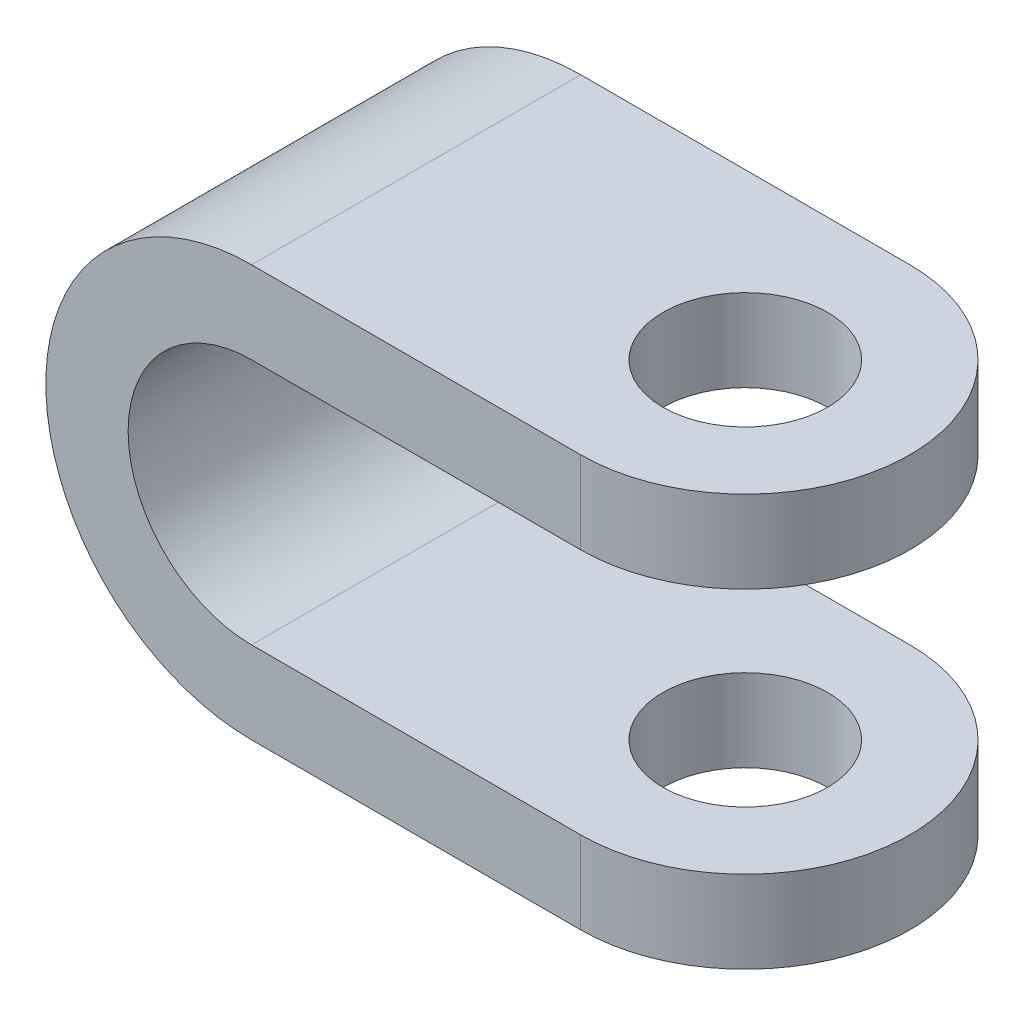
ISO-10303-21;
HEADER;
FILE_DESCRIPTION(('STEP AP214'),'2;1');
FILE_NAME('part.step','',(''),(''),'','','');
FILE_SCHEMA(('AUTOMOTIVE_DESIGN { 1 0 10303 214 1 1 1 1 }'));
ENDSEC;
DATA;
#1=APPLICATION_CONTEXT('core data for automotive mechanical design processes');
#2=APPLICATION_PROTOCOL_DEFINITION('international standard','automotive_design',2000,#1);
#3=PRODUCT_CONTEXT('',#1,'mechanical');
#4=PRODUCT('Part','Part','',(#3));
#5=PRODUCT_RELATED_PRODUCT_CATEGORY('part','',(#4));
#6=PRODUCT_DEFINITION_FORMATION('','',#4);
#7=PRODUCT_DEFINITION_CONTEXT('part definition',#1,'design');
#8=PRODUCT_DEFINITION('design','',#6,#7);
#9=PRODUCT_DEFINITION_SHAPE('','',#8);
#10=(LENGTH_UNIT() NAMED_UNIT(*) SI_UNIT(.MILLI.,.METRE.));
#11=(NAMED_UNIT(*) PLANE_ANGLE_UNIT() SI_UNIT($,.RADIAN.));
#12=(NAMED_UNIT(*) SI_UNIT($,.STERADIAN.) SOLID_ANGLE_UNIT());
#13=UNCERTAINTY_MEASURE_WITH_UNIT(LENGTH_MEASURE(1.E-05),#10,'distance_accuracy_value','');
#14=(GEOMETRIC_REPRESENTATION_CONTEXT(3) GLOBAL_UNCERTAINTY_ASSIGNED_CONTEXT((#13)) GLOBAL_UNIT_ASSIGNED_CONTEXT((#10,
#11,#12)) REPRESENTATION_CONTEXT('',''));
#15=CARTESIAN_POINT('',(0.,0.,0.));
#16=DIRECTION('',(0.,0.,1.));
#17=DIRECTION('',(1.,0.,0.));
#18=AXIS2_PLACEMENT_3D('',#15,#16,#17);
#19=CARTESIAN_POINT('',(-20.,-90.,45.));
#20=DIRECTION('',(0.,1.,0.));
#21=DIRECTION('',(0.,0.,1.));
#22=AXIS2_PLACEMENT_3D('',#19,#20,#21);
#23=CYLINDRICAL_SURFACE('',#22,10.);
#24=CARTESIAN_POINT('',(-20.,-25.,45.));
#25=DIRECTION('',(0.,-1.,0.));
#26=DIRECTION('',(1.,0.,0.));
#27=AXIS2_PLACEMENT_3D('',#24,#25,#26);
#28=CIRCLE('',#27,10.);
#29=CARTESIAN_POINT('',(-20.,-25.,55.));
#30=VERTEX_POINT('',#29);
#31=EDGE_CURVE('E201',#30,#30,#28,.F.);
#32=CARTESIAN_POINT('',(-20.,-15.,45.));
#33=DIRECTION('',(0.,-1.,0.));
#34=DIRECTION('',(1.,0.,0.));
#35=AXIS2_PLACEMENT_3D('',#32,#33,#34);
#36=CIRCLE('',#35,10.);
#37=CARTESIAN_POINT('',(-20.,-15.,55.));
#38=VERTEX_POINT('',#37);
#39=EDGE_CURVE('E123',#38,#38,#36,.F.);
#40=CARTESIAN_POINT('',(-20.,-25.,55.));
#41=CARTESIAN_POINT('',(-20.,-24.8958333333333,55.));
#42=CARTESIAN_POINT('',(-20.,-24.7916666666667,55.));
#43=CARTESIAN_POINT('',(-20.,-24.5833333333333,55.));
#44=CARTESIAN_POINT('',(-20.,-24.4791666666667,55.));
#45=CARTESIAN_POINT('',(-20.,-24.2708333333333,55.));
#46=CARTESIAN_POINT('',(-20.,-24.1666666666667,55.));
#47=CARTESIAN_POINT('',(-20.,-23.9583333333333,55.));
#48=CARTESIAN_POINT('',(-20.,-23.8541666666667,55.));
#49=CARTESIAN_POINT('',(-20.,-23.6458333333333,55.));
#50=CARTESIAN_POINT('',(-20.,-23.5416666666667,55.));
#51=CARTESIAN_POINT('',(-20.,-23.3333333333333,55.));
#52=CARTESIAN_POINT('',(-20.,-23.2291666666667,55.));
#53=CARTESIAN_POINT('',(-20.,-23.0208333333333,55.));
#54=CARTESIAN_POINT('',(-20.,-22.9166666666667,55.));
#55=CARTESIAN_POINT('',(-20.,-22.7083333333333,55.));
#56=CARTESIAN_POINT('',(-20.,-22.6041666666667,55.));
#57=CARTESIAN_POINT('',(-20.,-22.3958333333333,55.));
#58=CARTESIAN_POINT('',(-20.,-22.2916666666667,55.));
#59=CARTESIAN_POINT('',(-20.,-22.0833333333333,55.));
#60=CARTESIAN_POINT('',(-20.,-21.9791666666667,55.));
#61=CARTESIAN_POINT('',(-20.,-21.7708333333333,55.));
#62=CARTESIAN_POINT('',(-20.,-21.6666666666667,55.));
#63=CARTESIAN_POINT('',(-20.,-21.4583333333333,55.));
#64=CARTESIAN_POINT('',(-20.,-21.3541666666667,55.));
#65=CARTESIAN_POINT('',(-20.,-21.1458333333333,55.));
#66=CARTESIAN_POINT('',(-20.,-21.0416666666667,55.));
#67=CARTESIAN_POINT('',(-20.,-20.8333333333333,55.));
#68=CARTESIAN_POINT('',(-20.,-20.7291666666667,55.));
#69=CARTESIAN_POINT('',(-20.,-20.5208333333333,55.));
#70=CARTESIAN_POINT('',(-20.,-20.4166666666667,55.));
#71=CARTESIAN_POINT('',(-20.,-20.2083333333333,55.));
#72=CARTESIAN_POINT('',(-20.,-20.1041666666667,55.));
#73=CARTESIAN_POINT('',(-20.,-19.8958333333333,55.));
#74=CARTESIAN_POINT('',(-20.,-19.7916666666667,55.));
#75=CARTESIAN_POINT('',(-20.,-19.5833333333333,55.));
#76=CARTESIAN_POINT('',(-20.,-19.4791666666667,55.));
#77=CARTESIAN_POINT('',(-20.,-19.2708333333333,55.));
#78=CARTESIAN_POINT('',(-20.,-19.1666666666667,55.));
#79=CARTESIAN_POINT('',(-20.,-18.9583333333333,55.));
#80=CARTESIAN_POINT('',(-20.,-18.8541666666667,55.));
#81=CARTESIAN_POINT('',(-20.,-18.6458333333333,55.));
#82=CARTESIAN_POINT('',(-20.,-18.5416666666667,55.));
#83=CARTESIAN_POINT('',(-20.,-18.3333333333333,55.));
#84=CARTESIAN_POINT('',(-20.,-18.2291666666667,55.));
#85=CARTESIAN_POINT('',(-20.,-18.0208333333333,55.));
#86=CARTESIAN_POINT('',(-20.,-17.9166666666667,55.));
#87=CARTESIAN_POINT('',(-20.,-17.7083333333333,55.));
#88=CARTESIAN_POINT('',(-20.,-17.6041666666667,55.));
#89=CARTESIAN_POINT('',(-20.,-17.3958333333333,55.));
#90=CARTESIAN_POINT('',(-20.,-17.2916666666667,55.));
#91=CARTESIAN_POINT('',(-20.,-17.0833333333333,55.));
#92=CARTESIAN_POINT('',(-20.,-16.9791666666667,55.));
#93=CARTESIAN_POINT('',(-20.,-16.7708333333333,55.));
#94=CARTESIAN_POINT('',(-20.,-16.6666666666667,55.));
#95=CARTESIAN_POINT('',(-20.,-16.4583333333333,55.));
#96=CARTESIAN_POINT('',(-20.,-16.3541666666667,55.));
#97=CARTESIAN_POINT('',(-20.,-16.1458333333333,55.));
#98=CARTESIAN_POINT('',(-20.,-16.0416666666667,55.));
#99=CARTESIAN_POINT('',(-20.,-15.8333333333333,55.));
#100=CARTESIAN_POINT('',(-20.,-15.7291666666667,55.));
#101=CARTESIAN_POINT('',(-20.,-15.5208333333333,55.));
#102=CARTESIAN_POINT('',(-20.,-15.4166666666667,55.));
#103=CARTESIAN_POINT('',(-20.,-15.2083333333333,55.));
#104=CARTESIAN_POINT('',(-20.,-15.1041666666667,55.));
#105=CARTESIAN_POINT('',(-20.,-15.,55.));
#106=B_SPLINE_CURVE_WITH_KNOTS('',3,(#40,#41,#42,#43,#44,#45,#46,#47,#48,#49,#50,#51,#52,#53,
#54,#55,#56,#57,#58,#59,#60,#61,#62,#63,#64,#65,#66,#67,#68,#69,#70,#71,#72,#73,#74,#75,#76,#77,
#78,#79,#80,#81,#82,#83,#84,#85,#86,#87,#88,#89,#90,#91,#92,#93,#94,#95,#96,#97,#98,#99,#100,
#101,#102,#103,#104,#105),.UNSPECIFIED.,.F.,.F.,(4,2,2,2,2,2,2,2,2,2,2,2,2,2,2,2,2,2,2,2,2,2,2,
2,2,2,2,2,2,2,2,2,4),(0.,0.312499999999993,0.625000000000001,0.937500000000008,1.25,
1.56249999999999,1.875,2.18750000000001,2.5,2.8125,3.125,3.43750000000001,3.75,4.0625,4.375,
4.68750000000001,5.,5.3125,5.62500000000001,5.93750000000001,6.25000000000001,6.5625,
6.87500000000001,7.18750000000001,7.50000000000001,7.8125,8.12500000000001,8.43750000000001,
8.75000000000001,9.0625,9.37500000000001,9.68750000000002,10.),.UNSPECIFIED.);
#107=EDGE_CURVE('BSEAM43',#30,#38,#106,.T.);
#108=ORIENTED_EDGE('',*,*,#31,.F.);
#109=ORIENTED_EDGE('',*,*,#39,.T.);
#110=ORIENTED_EDGE('',*,*,#107,.T.);
#111=ORIENTED_EDGE('',*,*,#107,.F.);
#112=EDGE_LOOP('',(#108,#110,#109,#111));
#113=FACE_BOUND('',#112,.T.);
#114=ADVANCED_FACE('F43',(#113),#23,.F.);
#115=CARTESIAN_POINT('',(0.,-15.,90.));
#116=DIRECTION('',(0.,-1.,0.));
#117=DIRECTION('',(1.,0.,0.));
#118=AXIS2_PLACEMENT_3D('',#115,#116,#117);
#119=PLANE('',#118);
#120=CARTESIAN_POINT('',(-20.,-15.,45.));
#121=DIRECTION('',(0.,-1.,0.));
#122=DIRECTION('',(1.,0.,0.));
#123=AXIS2_PLACEMENT_3D('',#120,#121,#122);
#124=CIRCLE('',#123,20.);
#125=CARTESIAN_POINT('',(-20.,-15.0000000000001,65.));
#126=VERTEX_POINT('',#125);
#127=CARTESIAN_POINT('',(-20.,-15.,25.));
#128=VERTEX_POINT('',#127);
#129=EDGE_CURVE('E122',#126,#128,#124,.F.);
#130=ORIENTED_EDGE('',*,*,#129,.T.);
#131=DIRECTION('',(-1.,0.,0.));
#132=VECTOR('',#131,1.);
#133=CARTESIAN_POINT('',(-20.,-15.,25.));
#134=LINE('',#133,#132);
#135=CARTESIAN_POINT('',(-60.,-15.,25.));
#136=VERTEX_POINT('',#135);
#137=EDGE_CURVE('E134',#128,#136,#134,.T.);
#138=ORIENTED_EDGE('',*,*,#137,.T.);
#139=DIRECTION('',(0.,0.,-1.));
#140=VECTOR('',#139,1.);
#141=CARTESIAN_POINT('',(-60.,-15.,90.));
#142=LINE('',#141,#140);
#143=CARTESIAN_POINT('',(-60.,-15.,65.));
#144=VERTEX_POINT('',#143);
#145=EDGE_CURVE('E126',#144,#136,#142,.T.);
#146=ORIENTED_EDGE('',*,*,#145,.F.);
#147=DIRECTION('',(1.,0.,0.));
#148=VECTOR('',#147,1.);
#149=CARTESIAN_POINT('',(-85.,-15.,65.));
#150=LINE('',#149,#148);
#151=EDGE_CURVE('E108',#144,#126,#150,.T.);
#152=ORIENTED_EDGE('',*,*,#151,.T.);
#153=EDGE_LOOP('',(#130,#138,#146,#152));
#154=FACE_BOUND('',#153,.T.);
#155=ORIENTED_EDGE('',*,*,#39,.F.);
#156=EDGE_LOOP('',(#155));
#157=FACE_BOUND('',#156,.T.);
#158=ADVANCED_FACE('F132',(#154,#157),#119,.F.);
#159=CARTESIAN_POINT('',(-60.,-40.,90.));
#160=DIRECTION('',(0.,0.,-1.));
#161=DIRECTION('',(-1.,0.,0.));
#162=AXIS2_PLACEMENT_3D('',#159,#160,#161);
#163=CYLINDRICAL_SURFACE('',#162,25.);
#164=ORIENTED_EDGE('',*,*,#145,.T.);
#165=CARTESIAN_POINT('',(-60.,-40.,25.));
#166=DIRECTION('',(0.,0.,-1.));
#167=DIRECTION('',(-1.,0.,0.));
#168=AXIS2_PLACEMENT_3D('',#165,#166,#167);
#169=CIRCLE('',#168,25.);
#170=CARTESIAN_POINT('',(-60.,-65.,25.));
#171=VERTEX_POINT('',#170);
#172=EDGE_CURVE('E59',#136,#171,#169,.F.);
#173=ORIENTED_EDGE('',*,*,#172,.T.);
#174=DIRECTION('',(0.,0.,-1.));
#175=VECTOR('',#174,1.);
#176=CARTESIAN_POINT('',(-60.,-65.,90.));
#177=LINE('',#176,#175);
#178=CARTESIAN_POINT('',(-60.,-65.,65.));
#179=VERTEX_POINT('',#178);
#180=EDGE_CURVE('E128',#179,#171,#177,.T.);
#181=ORIENTED_EDGE('',*,*,#180,.F.);
#182=CARTESIAN_POINT('',(-60.,-40.,65.));
#183=DIRECTION('',(0.,0.,1.));
#184=DIRECTION('',(1.,0.,0.));
#185=AXIS2_PLACEMENT_3D('',#182,#183,#184);
#186=CIRCLE('',#185,25.);
#187=EDGE_CURVE('E113',#179,#144,#186,.F.);
#188=ORIENTED_EDGE('',*,*,#187,.T.);
#189=EDGE_LOOP('',(#164,#173,#181,#188));
#190=FACE_BOUND('',#189,.T.);
#191=ADVANCED_FACE('F125',(#190),#163,.T.);
#192=CARTESIAN_POINT('',(-60.,-65.,90.));
#193=DIRECTION('',(0.,1.,0.));
#194=DIRECTION('',(-1.,0.,0.));
#195=AXIS2_PLACEMENT_3D('',#192,#193,#194);
#196=PLANE('',#195);
#197=ORIENTED_EDGE('',*,*,#180,.T.);
#198=DIRECTION('',(1.,0.,0.));
#199=VECTOR('',#198,1.);
#200=CARTESIAN_POINT('',(-20.,-65.,25.));
#201=LINE('',#200,#199);
#202=CARTESIAN_POINT('',(-20.,-65.,25.));
#203=VERTEX_POINT('',#202);
#204=EDGE_CURVE('E130',#171,#203,#201,.T.);
#205=ORIENTED_EDGE('',*,*,#204,.T.);
#206=CARTESIAN_POINT('',(-20.,-65.,45.));
#207=DIRECTION('',(0.,1.,0.));
#208=DIRECTION('',(-1.,0.,0.));
#209=AXIS2_PLACEMENT_3D('',#206,#207,#208);
#210=CIRCLE('',#209,20.);
#211=CARTESIAN_POINT('',(-20.,-65.,65.));
#212=VERTEX_POINT('',#211);
#213=EDGE_CURVE('E178',#203,#212,#210,.F.);
#214=ORIENTED_EDGE('',*,*,#213,.T.);
#215=DIRECTION('',(-1.,0.,0.));
#216=VECTOR('',#215,1.);
#217=CARTESIAN_POINT('',(-85.,-65.,65.));
#218=LINE('',#217,#216);
#219=EDGE_CURVE('E175',#212,#179,#218,.T.);
#220=ORIENTED_EDGE('',*,*,#219,.T.);
#221=EDGE_LOOP('',(#197,#205,#214,#220));
#222=FACE_BOUND('',#221,.T.);
#223=CARTESIAN_POINT('',(-20.,-65.,45.));
#224=DIRECTION('',(0.,1.,0.));
#225=DIRECTION('',(-1.,0.,0.));
#226=AXIS2_PLACEMENT_3D('',#223,#224,#225);
#227=CIRCLE('',#226,10.);
#228=CARTESIAN_POINT('',(-20.,-65.,55.));
#229=VERTEX_POINT('',#228);
#230=EDGE_CURVE('E174',#229,#229,#227,.F.);
#231=ORIENTED_EDGE('',*,*,#230,.F.);
#232=EDGE_LOOP('',(#231));
#233=FACE_BOUND('',#232,.T.);
#234=ADVANCED_FACE('F213',(#222,#233),#196,.F.);
#235=CARTESIAN_POINT('',(-60.,-55.,90.));
#236=DIRECTION('',(0.,1.,0.));
#237=DIRECTION('',(-1.,0.,0.));
#238=AXIS2_PLACEMENT_3D('',#235,#236,#237);
#239=PLANE('',#238);
#240=DIRECTION('',(1.,0.,0.));
#241=VECTOR('',#240,1.);
#242=CARTESIAN_POINT('',(-20.,-55.,25.));
#243=LINE('',#242,#241);
#244=CARTESIAN_POINT('',(-60.,-55.,25.0000000000001));
#245=VERTEX_POINT('',#244);
#246=CARTESIAN_POINT('',(-20.,-55.,25.));
#247=VERTEX_POINT('',#246);
#248=EDGE_CURVE('E170',#245,#247,#243,.T.);
#249=ORIENTED_EDGE('',*,*,#248,.F.);
#250=DIRECTION('',(0.,0.,-1.));
#251=VECTOR('',#250,1.);
#252=CARTESIAN_POINT('',(-60.,-55.,90.));
#253=LINE('',#252,#251);
#254=CARTESIAN_POINT('',(-60.,-55.,65.));
#255=VERTEX_POINT('',#254);
#256=EDGE_CURVE('E141',#255,#245,#253,.T.);
#257=ORIENTED_EDGE('',*,*,#256,.F.);
#258=DIRECTION('',(-1.,0.,0.));
#259=VECTOR('',#258,1.);
#260=CARTESIAN_POINT('',(-85.,-55.,65.));
#261=LINE('',#260,#259);
#262=CARTESIAN_POINT('',(-20.,-55.,65.));
#263=VERTEX_POINT('',#262);
#264=EDGE_CURVE('E163',#263,#255,#261,.T.);
#265=ORIENTED_EDGE('',*,*,#264,.F.);
#266=CARTESIAN_POINT('',(-20.,-55.,45.));
#267=DIRECTION('',(0.,1.,0.));
#268=DIRECTION('',(-1.,0.,0.));
#269=AXIS2_PLACEMENT_3D('',#266,#267,#268);
#270=CIRCLE('',#269,20.);
#271=EDGE_CURVE('E167',#247,#263,#270,.F.);
#272=ORIENTED_EDGE('',*,*,#271,.F.);
#273=EDGE_LOOP('',(#249,#257,#265,#272));
#274=FACE_BOUND('',#273,.T.);
#275=CARTESIAN_POINT('',(-20.,-55.,45.));
#276=DIRECTION('',(0.,1.,0.));
#277=DIRECTION('',(-1.,0.,0.));
#278=AXIS2_PLACEMENT_3D('',#275,#276,#277);
#279=CIRCLE('',#278,10.);
#280=CARTESIAN_POINT('',(-20.,-55.,55.));
#281=VERTEX_POINT('',#280);
#282=EDGE_CURVE('E52',#281,#281,#279,.F.);
#283=ORIENTED_EDGE('',*,*,#282,.T.);
#284=EDGE_LOOP('',(#283));
#285=FACE_BOUND('',#284,.T.);
#286=ADVANCED_FACE('F215',(#274,#285),#239,.T.);
#287=CARTESIAN_POINT('',(0.,-25.,90.));
#288=DIRECTION('',(0.,-1.,0.));
#289=DIRECTION('',(1.,0.,0.));
#290=AXIS2_PLACEMENT_3D('',#287,#288,#289);
#291=PLANE('',#290);
#292=DIRECTION('',(-1.,0.,0.));
#293=VECTOR('',#292,1.);
#294=CARTESIAN_POINT('',(-20.,-25.,25.));
#295=LINE('',#294,#293);
#296=CARTESIAN_POINT('',(-20.,-25.,25.));
#297=VERTEX_POINT('',#296);
#298=CARTESIAN_POINT('',(-60.,-25.,25.));
#299=VERTEX_POINT('',#298);
#300=EDGE_CURVE('E159',#297,#299,#295,.T.);
#301=ORIENTED_EDGE('',*,*,#300,.F.);
#302=CARTESIAN_POINT('',(-20.,-25.,45.));
#303=DIRECTION('',(0.,-1.,0.));
#304=DIRECTION('',(1.,0.,0.));
#305=AXIS2_PLACEMENT_3D('',#302,#303,#304);
#306=CIRCLE('',#305,20.);
#307=CARTESIAN_POINT('',(-20.,-25.,65.));
#308=VERTEX_POINT('',#307);
#309=EDGE_CURVE('E155',#308,#297,#306,.F.);
#310=ORIENTED_EDGE('',*,*,#309,.F.);
#311=DIRECTION('',(1.,0.,0.));
#312=VECTOR('',#311,1.);
#313=CARTESIAN_POINT('',(-85.,-25.,65.));
#314=LINE('',#313,#312);
#315=CARTESIAN_POINT('',(-60.,-25.,65.));
#316=VERTEX_POINT('',#315);
#317=EDGE_CURVE('E152',#316,#308,#314,.T.);
#318=ORIENTED_EDGE('',*,*,#317,.F.);
#319=DIRECTION('',(0.,0.,-1.));
#320=VECTOR('',#319,1.);
#321=CARTESIAN_POINT('',(-60.,-25.,90.));
#322=LINE('',#321,#320);
#323=EDGE_CURVE('E136',#316,#299,#322,.T.);
#324=ORIENTED_EDGE('',*,*,#323,.T.);
#325=EDGE_LOOP('',(#301,#310,#318,#324));
#326=FACE_BOUND('',#325,.T.);
#327=ORIENTED_EDGE('',*,*,#31,.T.);
#328=EDGE_LOOP('',(#327));
#329=FACE_BOUND('',#328,.T.);
#330=ADVANCED_FACE('F222',(#326,#329),#291,.T.);
#331=CARTESIAN_POINT('',(-60.,-40.,90.));
#332=DIRECTION('',(0.,0.,-1.));
#333=DIRECTION('',(-1.,0.,0.));
#334=AXIS2_PLACEMENT_3D('',#331,#332,#333);
#335=CYLINDRICAL_SURFACE('',#334,15.);
#336=CARTESIAN_POINT('',(-60.,-40.,25.));
#337=DIRECTION('',(0.,0.,-1.));
#338=DIRECTION('',(-1.,0.,0.));
#339=AXIS2_PLACEMENT_3D('',#336,#337,#338);
#340=CIRCLE('',#339,15.);
#341=EDGE_CURVE('E186',#299,#245,#340,.F.);
#342=ORIENTED_EDGE('',*,*,#341,.F.);
#343=ORIENTED_EDGE('',*,*,#323,.F.);
#344=CARTESIAN_POINT('',(-60.,-40.,65.));
#345=DIRECTION('',(0.,0.,1.));
#346=DIRECTION('',(1.,0.,0.));
#347=AXIS2_PLACEMENT_3D('',#344,#345,#346);
#348=CIRCLE('',#347,15.);
#349=EDGE_CURVE('E11',#255,#316,#348,.F.);
#350=ORIENTED_EDGE('',*,*,#349,.F.);
#351=ORIENTED_EDGE('',*,*,#256,.T.);
#352=EDGE_LOOP('',(#342,#343,#350,#351));
#353=FACE_BOUND('',#352,.T.);
#354=ADVANCED_FACE('F237',(#353),#335,.F.);
#355=CARTESIAN_POINT('',(-20.,-55.,55.));
#356=CARTESIAN_POINT('',(-20.,-55.1041666666667,55.));
#357=CARTESIAN_POINT('',(-20.,-55.2083333333333,55.));
#358=CARTESIAN_POINT('',(-20.,-55.4166666666667,55.));
#359=CARTESIAN_POINT('',(-20.,-55.5208333333333,55.));
#360=CARTESIAN_POINT('',(-20.,-55.7291666666667,55.));
#361=CARTESIAN_POINT('',(-20.,-55.8333333333333,55.));
#362=CARTESIAN_POINT('',(-20.,-56.0416666666667,55.));
#363=CARTESIAN_POINT('',(-20.,-56.1458333333333,55.));
#364=CARTESIAN_POINT('',(-20.,-56.3541666666667,55.));
#365=CARTESIAN_POINT('',(-20.,-56.4583333333333,55.));
#366=CARTESIAN_POINT('',(-20.,-56.6666666666667,55.));
#367=CARTESIAN_POINT('',(-20.,-56.7708333333333,55.));
#368=CARTESIAN_POINT('',(-20.,-56.9791666666667,55.));
#369=CARTESIAN_POINT('',(-20.,-57.0833333333333,55.));
#370=CARTESIAN_POINT('',(-20.,-57.2916666666667,55.));
#371=CARTESIAN_POINT('',(-20.,-57.3958333333333,55.));
#372=CARTESIAN_POINT('',(-20.,-57.6041666666667,55.));
#373=CARTESIAN_POINT('',(-20.,-57.7083333333333,55.));
#374=CARTESIAN_POINT('',(-20.,-57.9166666666667,55.));
#375=CARTESIAN_POINT('',(-20.,-58.0208333333333,55.));
#376=CARTESIAN_POINT('',(-20.,-58.2291666666667,55.));
#377=CARTESIAN_POINT('',(-20.,-58.3333333333333,55.));
#378=CARTESIAN_POINT('',(-20.,-58.5416666666667,55.));
#379=CARTESIAN_POINT('',(-20.,-58.6458333333333,55.));
#380=CARTESIAN_POINT('',(-20.,-58.8541666666667,55.));
#381=CARTESIAN_POINT('',(-20.,-58.9583333333333,55.));
#382=CARTESIAN_POINT('',(-20.,-59.1666666666667,55.));
#383=CARTESIAN_POINT('',(-20.,-59.2708333333333,55.));
#384=CARTESIAN_POINT('',(-20.,-59.4791666666667,55.));
#385=CARTESIAN_POINT('',(-20.,-59.5833333333333,55.));
#386=CARTESIAN_POINT('',(-20.,-59.7916666666667,55.));
#387=CARTESIAN_POINT('',(-20.,-59.8958333333333,55.));
#388=CARTESIAN_POINT('',(-20.,-60.1041666666667,55.));
#389=CARTESIAN_POINT('',(-20.,-60.2083333333333,55.));
#390=CARTESIAN_POINT('',(-20.,-60.4166666666667,55.));
#391=CARTESIAN_POINT('',(-20.,-60.5208333333333,55.));
#392=CARTESIAN_POINT('',(-20.,-60.7291666666667,55.));
#393=CARTESIAN_POINT('',(-20.,-60.8333333333333,55.));
#394=CARTESIAN_POINT('',(-20.,-61.0416666666667,55.));
#395=CARTESIAN_POINT('',(-20.,-61.1458333333333,55.));
#396=CARTESIAN_POINT('',(-20.,-61.3541666666667,55.));
#397=CARTESIAN_POINT('',(-20.,-61.4583333333333,55.));
#398=CARTESIAN_POINT('',(-20.,-61.6666666666667,55.));
#399=CARTESIAN_POINT('',(-20.,-61.7708333333333,55.));
#400=CARTESIAN_POINT('',(-20.,-61.9791666666667,55.));
#401=CARTESIAN_POINT('',(-20.,-62.0833333333333,55.));
#402=CARTESIAN_POINT('',(-20.,-62.2916666666667,55.));
#403=CARTESIAN_POINT('',(-20.,-62.3958333333333,55.));
#404=CARTESIAN_POINT('',(-20.,-62.6041666666667,55.));
#405=CARTESIAN_POINT('',(-20.,-62.7083333333333,55.));
#406=CARTESIAN_POINT('',(-20.,-62.9166666666667,55.));
#407=CARTESIAN_POINT('',(-20.,-63.0208333333333,55.));
#408=CARTESIAN_POINT('',(-20.,-63.2291666666667,55.));
#409=CARTESIAN_POINT('',(-20.,-63.3333333333333,55.));
#410=CARTESIAN_POINT('',(-20.,-63.5416666666667,55.));
#411=CARTESIAN_POINT('',(-20.,-63.6458333333333,55.));
#412=CARTESIAN_POINT('',(-20.,-63.8541666666667,55.));
#413=CARTESIAN_POINT('',(-20.,-63.9583333333333,55.));
#414=CARTESIAN_POINT('',(-20.,-64.1666666666667,55.));
#415=CARTESIAN_POINT('',(-20.,-64.2708333333333,55.));
#416=CARTESIAN_POINT('',(-20.,-64.4791666666667,55.));
#417=CARTESIAN_POINT('',(-20.,-64.5833333333333,55.));
#418=CARTESIAN_POINT('',(-20.,-64.7916666666667,55.));
#419=CARTESIAN_POINT('',(-20.,-64.8958333333333,55.));
#420=CARTESIAN_POINT('',(-20.,-65.,55.));
#421=B_SPLINE_CURVE_WITH_KNOTS('',3,(#355,#356,#357,#358,#359,#360,#361,#362,#363,#364,#365,
#366,#367,#368,#369,#370,#371,#372,#373,#374,#375,#376,#377,#378,#379,#380,#381,#382,#383,#384,
#385,#386,#387,#388,#389,#390,#391,#392,#393,#394,#395,#396,#397,#398,#399,#400,#401,#402,#403,
#404,#405,#406,#407,#408,#409,#410,#411,#412,#413,#414,#415,#416,#417,#418,#419,#420),
.UNSPECIFIED.,.F.,.F.,(4,2,2,2,2,2,2,2,2,2,2,2,2,2,2,2,2,2,2,2,2,2,2,2,2,2,2,2,2,2,2,2,4),(0.,
0.3125,0.625000000000001,0.937500000000001,1.25,1.5625,1.875,2.1875,2.5,2.8125,3.125,3.4375,
3.75,4.0625,4.375,4.6875,5.,5.3125,5.625,5.9375,6.25,6.5625,6.875,7.18749999999999,7.5,
7.81249999999999,8.125,8.43749999999999,8.75,9.06249999999999,9.375,9.68749999999999,10.),.UNSPECIFIED.);
#422=EDGE_CURVE('BSEAM211',#281,#229,#421,.T.);
#423=ORIENTED_EDGE('',*,*,#282,.F.);
#424=ORIENTED_EDGE('',*,*,#230,.T.);
#425=ORIENTED_EDGE('',*,*,#422,.T.);
#426=ORIENTED_EDGE('',*,*,#422,.F.);
#427=EDGE_LOOP('',(#423,#425,#424,#426));
#428=FACE_BOUND('',#427,.T.);
#429=ADVANCED_FACE('F211',(#428),#23,.F.);
#430=CARTESIAN_POINT('',(-20.,-90.,25.));
#431=DIRECTION('',(0.,0.,-1.));
#432=DIRECTION('',(-1.,0.,0.));
#433=AXIS2_PLACEMENT_3D('',#430,#431,#432);
#434=PLANE('',#433);
#435=ORIENTED_EDGE('',*,*,#341,.T.);
#436=ORIENTED_EDGE('',*,*,#248,.T.);
#437=DIRECTION('',(0.,1.,0.));
#438=VECTOR('',#437,1.);
#439=CARTESIAN_POINT('',(-20.,-90.,25.));
#440=LINE('',#439,#438);
#441=EDGE_CURVE('E194',#203,#247,#440,.T.);
#442=ORIENTED_EDGE('',*,*,#441,.F.);
#443=ORIENTED_EDGE('',*,*,#204,.F.);
#444=ORIENTED_EDGE('',*,*,#172,.F.);
#445=ORIENTED_EDGE('',*,*,#137,.F.);
#446=EDGE_CURVE('E190',#297,#128,#440,.T.);
#447=ORIENTED_EDGE('',*,*,#446,.F.);
#448=ORIENTED_EDGE('',*,*,#300,.T.);
#449=EDGE_LOOP('',(#435,#436,#442,#443,#444,#445,#447,#448));
#450=FACE_BOUND('',#449,.T.);
#451=ADVANCED_FACE('F45',(#450),#434,.T.);
#452=CARTESIAN_POINT('',(-20.,-90.,45.));
#453=DIRECTION('',(0.,1.,0.));
#454=DIRECTION('',(0.,0.,1.));
#455=AXIS2_PLACEMENT_3D('',#452,#453,#454);
#456=CYLINDRICAL_SURFACE('',#455,20.);
#457=ORIENTED_EDGE('',*,*,#213,.F.);
#458=ORIENTED_EDGE('',*,*,#441,.T.);
#459=ORIENTED_EDGE('',*,*,#271,.T.);
#460=DIRECTION('',(0.,1.,0.));
#461=VECTOR('',#460,1.);
#462=CARTESIAN_POINT('',(-20.,-90.,65.));
#463=LINE('',#462,#461);
#464=EDGE_CURVE('E195',#212,#263,#463,.T.);
#465=ORIENTED_EDGE('',*,*,#464,.F.);
#466=EDGE_LOOP('',(#457,#458,#459,#465));
#467=FACE_BOUND('',#466,.T.);
#468=ADVANCED_FACE('F243',(#467),#456,.T.);
#469=EDGE_CURVE('E117',#308,#126,#463,.T.);
#470=ORIENTED_EDGE('',*,*,#469,.F.);
#471=ORIENTED_EDGE('',*,*,#309,.T.);
#472=ORIENTED_EDGE('',*,*,#446,.T.);
#473=ORIENTED_EDGE('',*,*,#129,.F.);
#474=EDGE_LOOP('',(#470,#471,#472,#473));
#475=FACE_BOUND('',#474,.T.);
#476=ADVANCED_FACE('F258',(#475),#456,.T.);
#477=CARTESIAN_POINT('',(-85.,-90.,65.));
#478=DIRECTION('',(0.,0.,1.));
#479=DIRECTION('',(1.,0.,0.));
#480=AXIS2_PLACEMENT_3D('',#477,#478,#479);
#481=PLANE('',#480);
#482=ORIENTED_EDGE('',*,*,#464,.T.);
#483=ORIENTED_EDGE('',*,*,#264,.T.);
#484=ORIENTED_EDGE('',*,*,#349,.T.);
#485=ORIENTED_EDGE('',*,*,#317,.T.);
#486=ORIENTED_EDGE('',*,*,#469,.T.);
#487=ORIENTED_EDGE('',*,*,#151,.F.);
#488=ORIENTED_EDGE('',*,*,#187,.F.);
#489=ORIENTED_EDGE('',*,*,#219,.F.);
#490=EDGE_LOOP('',(#482,#483,#484,#485,#486,#487,#488,#489));
#491=FACE_BOUND('',#490,.T.);
#492=ADVANCED_FACE('F111',(#491),#481,.T.);
#493=CLOSED_SHELL('',(#114,#158,#191,#234,#286,#330,#354,#429,#451,#468,#476,#492));
#494=MANIFOLD_SOLID_BREP('B2',#493);
#495=ADVANCED_BREP_SHAPE_REPRESENTATION('',(#18,#494),#14);
#496=SHAPE_DEFINITION_REPRESENTATION(#9,#495);
ENDSEC;
END-ISO-10303-21;
